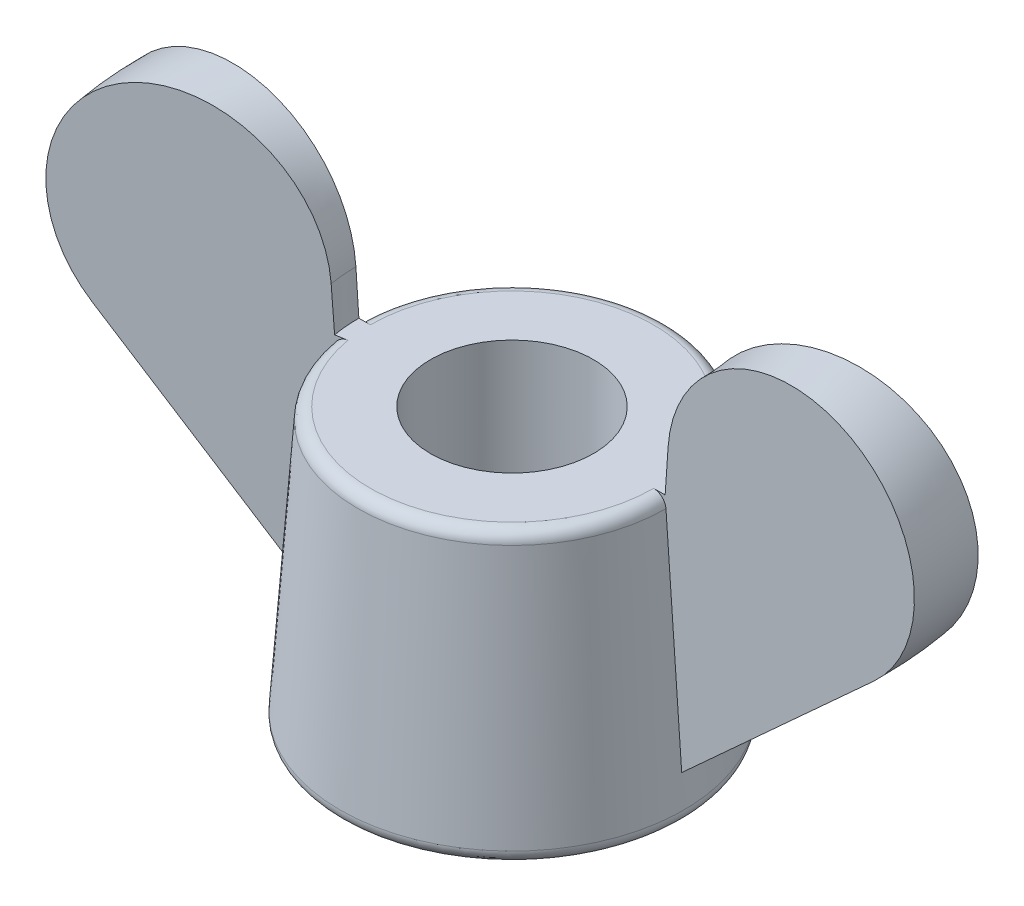
ISO-10303-21;
HEADER;
FILE_DESCRIPTION(('STEP AP214'),'2;1');
FILE_NAME('part.step','',(''),(''),'','','');
FILE_SCHEMA(('AUTOMOTIVE_DESIGN { 1 0 10303 214 1 1 1 1 }'));
ENDSEC;
DATA;
#1=APPLICATION_CONTEXT('core data for automotive mechanical design processes');
#2=APPLICATION_PROTOCOL_DEFINITION('international standard','automotive_design',2000,#1);
#3=PRODUCT_CONTEXT('',#1,'mechanical');
#4=PRODUCT('Part','Part','',(#3));
#5=PRODUCT_RELATED_PRODUCT_CATEGORY('part','',(#4));
#6=PRODUCT_DEFINITION_FORMATION('','',#4);
#7=PRODUCT_DEFINITION_CONTEXT('part definition',#1,'design');
#8=PRODUCT_DEFINITION('design','',#6,#7);
#9=PRODUCT_DEFINITION_SHAPE('','',#8);
#10=(LENGTH_UNIT() NAMED_UNIT(*) SI_UNIT(.MILLI.,.METRE.));
#11=(NAMED_UNIT(*) PLANE_ANGLE_UNIT() SI_UNIT($,.RADIAN.));
#12=(NAMED_UNIT(*) SI_UNIT($,.STERADIAN.) SOLID_ANGLE_UNIT());
#13=UNCERTAINTY_MEASURE_WITH_UNIT(LENGTH_MEASURE(1.E-05),#10,'distance_accuracy_value','');
#14=(GEOMETRIC_REPRESENTATION_CONTEXT(3) GLOBAL_UNCERTAINTY_ASSIGNED_CONTEXT((#13)) GLOBAL_UNIT_ASSIGNED_CONTEXT((#10,
#11,#12)) REPRESENTATION_CONTEXT('',''));
#15=CARTESIAN_POINT('',(0.,0.,0.));
#16=DIRECTION('',(0.,0.,1.));
#17=DIRECTION('',(1.,0.,0.));
#18=AXIS2_PLACEMENT_3D('',#15,#16,#17);
#19=CARTESIAN_POINT('',(0.,5.6,0.));
#20=DIRECTION('',(0.,-1.,0.));
#21=DIRECTION('',(0.,0.,-1.));
#22=AXIS2_PLACEMENT_3D('',#19,#20,#21);
#23=CONICAL_SURFACE('',#22,3.1,0.0713074647852909);
#24=CARTESIAN_POINT('',(0.,0.267811762496978,0.));
#25=DIRECTION('',(0.,-1.,0.));
#26=DIRECTION('',(0.,0.,-1.));
#27=AXIS2_PLACEMENT_3D('',#24,#25,#26);
#28=CIRCLE('',#27,3.48087058839308);
#29=CARTESIAN_POINT('',(0.,0.267811762496978,-3.48087058839308));
#30=VERTEX_POINT('',#29);
#31=EDGE_CURVE('E212',#30,#30,#28,.F.);
#32=ORIENTED_EDGE('',*,*,#31,.T.);
#33=EDGE_LOOP('',(#32));
#34=FACE_BOUND('',#33,.T.);
#35=DIRECTION('',(0.0712470499879102,0.997458699830735,0.));
#36=VECTOR('',#35,1.);
#37=CARTESIAN_POINT('',(0.,48.9999999999996,0.));
#38=LINE('',#37,#36);
#39=CARTESIAN_POINT('',(-3.43558406990929,0.901823021269996,0.));
#40=VERTEX_POINT('',#39);
#41=CARTESIAN_POINT('',(-3.11658487410736,5.36781176249697,0.));
#42=VERTEX_POINT('',#41);
#43=EDGE_CURVE('E152',#40,#42,#38,.T.);
#44=ORIENTED_EDGE('',*,*,#43,.T.);
#45=CARTESIAN_POINT('',(0.,5.36781176249698,0.));
#46=DIRECTION('',(0.,1.,0.));
#47=DIRECTION('',(0.,0.,1.));
#48=AXIS2_PLACEMENT_3D('',#45,#46,#47);
#49=CIRCLE('',#48,3.11658487410736);
#50=CARTESIAN_POINT('',(3.0692369469415,5.36781176249697,-0.541189283933064));
#51=VERTEX_POINT('',#50);
#52=EDGE_CURVE('E218',#42,#51,#49,.F.);
#53=ORIENTED_EDGE('',*,*,#52,.T.);
#54=DIRECTION('',(-0.0701646472073423,0.997458699830735,0.0123719203945453));
#55=VECTOR('',#54,1.);
#56=CARTESIAN_POINT('',(0.,48.9999999999996,0.));
#57=LINE('',#56,#55);
#58=CARTESIAN_POINT('',(3.3833898281719,0.901823021269996,-0.596582912961285));
#59=VERTEX_POINT('',#58);
#60=EDGE_CURVE('E201',#59,#51,#57,.T.);
#61=ORIENTED_EDGE('',*,*,#60,.F.);
#62=CARTESIAN_POINT('',(0.,0.901823021269996,0.));
#63=DIRECTION('',(0.,1.,0.));
#64=DIRECTION('',(0.,0.,1.));
#65=AXIS2_PLACEMENT_3D('',#62,#63,#64);
#66=CIRCLE('',#65,3.43558406990929);
#67=CARTESIAN_POINT('',(3.43558406990929,0.901823021269995,0.));
#68=VERTEX_POINT('',#67);
#69=EDGE_CURVE('E210',#59,#68,#66,.F.);
#70=ORIENTED_EDGE('',*,*,#69,.T.);
#71=DIRECTION('',(-0.0712470499879102,0.997458699830735,0.));
#72=VECTOR('',#71,1.);
#73=CARTESIAN_POINT('',(0.,48.9999999999996,0.));
#74=LINE('',#73,#72);
#75=CARTESIAN_POINT('',(3.11658487410736,5.36781176249697,0.));
#76=VERTEX_POINT('',#75);
#77=EDGE_CURVE('E207',#68,#76,#74,.T.);
#78=ORIENTED_EDGE('',*,*,#77,.T.);
#79=CARTESIAN_POINT('',(0.,5.36781176249697,0.));
#80=DIRECTION('',(0.,1.,0.));
#81=DIRECTION('',(0.,0.,1.));
#82=AXIS2_PLACEMENT_3D('',#79,#80,#81);
#83=CIRCLE('',#82,3.11658487410736);
#84=CARTESIAN_POINT('',(-3.0692369469415,5.36781176249697,0.541189283933066));
#85=VERTEX_POINT('',#84);
#86=EDGE_CURVE('E215',#76,#85,#83,.F.);
#87=ORIENTED_EDGE('',*,*,#86,.T.);
#88=DIRECTION('',(0.0701646472073423,0.997458699830735,-0.0123719203945454));
#89=VECTOR('',#88,1.);
#90=CARTESIAN_POINT('',(0.,48.9999999999996,0.));
#91=LINE('',#90,#89);
#92=CARTESIAN_POINT('',(-3.3833898281719,0.901823021269995,0.596582912961287));
#93=VERTEX_POINT('',#92);
#94=EDGE_CURVE('E178',#93,#85,#91,.T.);
#95=ORIENTED_EDGE('',*,*,#94,.F.);
#96=CARTESIAN_POINT('',(0.,0.901823021269996,0.));
#97=DIRECTION('',(0.,-1.,0.));
#98=DIRECTION('',(0.173648177666931,0.,0.984807753012208));
#99=AXIS2_PLACEMENT_3D('',#96,#97,#98);
#100=CIRCLE('',#99,3.43558406990929);
#101=EDGE_CURVE('E157',#40,#93,#100,.F.);
#102=ORIENTED_EDGE('',*,*,#101,.F.);
#103=EDGE_LOOP('',(#44,#53,#61,#70,#78,#87,#95,#102));
#104=FACE_BOUND('',#103,.T.);
#105=ADVANCED_FACE('F46',(#34,#104),#23,.T.);
#106=CARTESIAN_POINT('',(0.,5.6,0.));
#107=DIRECTION('',(0.,-1.,0.));
#108=DIRECTION('',(0.,0.,-1.));
#109=AXIS2_PLACEMENT_3D('',#106,#107,#108);
#110=PLANE('',#109);
#111=CARTESIAN_POINT('',(0.,5.6,0.));
#112=DIRECTION('',(0.,1.,0.));
#113=DIRECTION('',(0.,0.,1.));
#114=AXIS2_PLACEMENT_3D('',#111,#112,#113);
#115=CIRCLE('',#114,1.64999999999999);
#116=CARTESIAN_POINT('',(0.,5.6,1.64999999999999));
#117=VERTEX_POINT('',#116);
#118=EDGE_CURVE('E162',#117,#117,#115,.T.);
#119=ORIENTED_EDGE('',*,*,#118,.F.);
#120=EDGE_LOOP('',(#119));
#121=FACE_BOUND('',#120,.T.);
#122=CARTESIAN_POINT('',(0.,5.6,0.));
#123=DIRECTION('',(0.,-1.,0.));
#124=DIRECTION('',(0.,0.,-1.));
#125=AXIS2_PLACEMENT_3D('',#122,#123,#124);
#126=CIRCLE('',#125,3.1);
#127=CARTESIAN_POINT('',(3.05290403433784,5.6,-0.538309350767485));
#128=VERTEX_POINT('',#127);
#129=CARTESIAN_POINT('',(3.1,5.6,0.));
#130=VERTEX_POINT('',#129);
#131=EDGE_CURVE('E204',#128,#130,#126,.T.);
#132=ORIENTED_EDGE('',*,*,#131,.F.);
#133=DIRECTION('',(-0.984807753012208,0.,0.173648177666931));
#134=VECTOR('',#133,1.);
#135=CARTESIAN_POINT('',(0.,5.6,0.));
#136=LINE('',#135,#134);
#137=CARTESIAN_POINT('',(2.82366068171581,5.6,-0.497887562552155));
#138=VERTEX_POINT('',#137);
#139=EDGE_CURVE('E69',#128,#138,#136,.T.);
#140=ORIENTED_EDGE('',*,*,#139,.T.);
#141=CARTESIAN_POINT('',(0.,5.6,0.));
#142=DIRECTION('',(0.,-1.,0.));
#143=DIRECTION('',(0.,0.,-1.));
#144=AXIS2_PLACEMENT_3D('',#141,#142,#143);
#145=CIRCLE('',#144,2.86722019914968);
#146=CARTESIAN_POINT('',(-2.86722019914968,5.6,0.));
#147=VERTEX_POINT('',#146);
#148=EDGE_CURVE('E229',#138,#147,#145,.F.);
#149=ORIENTED_EDGE('',*,*,#148,.T.);
#150=DIRECTION('',(-1.,0.,0.));
#151=VECTOR('',#150,1.);
#152=CARTESIAN_POINT('',(0.,5.6,0.));
#153=LINE('',#152,#151);
#154=CARTESIAN_POINT('',(-3.1,5.6,0.));
#155=VERTEX_POINT('',#154);
#156=EDGE_CURVE('E227',#147,#155,#153,.T.);
#157=ORIENTED_EDGE('',*,*,#156,.T.);
#158=CARTESIAN_POINT('',(0.,5.6,0.));
#159=DIRECTION('',(0.,1.,0.));
#160=DIRECTION('',(-0.173648177666931,0.,-0.984807753012208));
#161=AXIS2_PLACEMENT_3D('',#158,#159,#160);
#162=CIRCLE('',#161,3.1);
#163=CARTESIAN_POINT('',(-3.05290403433784,5.6,0.538309350767487));
#164=VERTEX_POINT('',#163);
#165=EDGE_CURVE('E176',#155,#164,#162,.T.);
#166=ORIENTED_EDGE('',*,*,#165,.T.);
#167=DIRECTION('',(0.984807753012208,0.,-0.173648177666931));
#168=VECTOR('',#167,1.);
#169=CARTESIAN_POINT('',(0.,5.6,0.));
#170=LINE('',#169,#168);
#171=CARTESIAN_POINT('',(-2.82366068171581,5.6,0.497887562552157));
#172=VERTEX_POINT('',#171);
#173=EDGE_CURVE('E61',#164,#172,#170,.T.);
#174=ORIENTED_EDGE('',*,*,#173,.T.);
#175=CARTESIAN_POINT('',(0.,5.6,0.));
#176=DIRECTION('',(0.,-1.,0.));
#177=DIRECTION('',(0.,0.,-1.));
#178=AXIS2_PLACEMENT_3D('',#175,#176,#177);
#179=CIRCLE('',#178,2.86722019914968);
#180=CARTESIAN_POINT('',(2.86722019914968,5.6,0.));
#181=VERTEX_POINT('',#180);
#182=EDGE_CURVE('E223',#172,#181,#179,.F.);
#183=ORIENTED_EDGE('',*,*,#182,.T.);
#184=DIRECTION('',(1.,0.,0.));
#185=VECTOR('',#184,1.);
#186=CARTESIAN_POINT('',(0.,5.6,0.));
#187=LINE('',#186,#185);
#188=EDGE_CURVE('E221',#181,#130,#187,.T.);
#189=ORIENTED_EDGE('',*,*,#188,.T.);
#190=EDGE_LOOP('',(#132,#140,#149,#157,#166,#174,#183,#189));
#191=FACE_BOUND('',#190,.T.);
#192=ADVANCED_FACE('F243',(#121,#191),#110,.F.);
#193=CARTESIAN_POINT('',(0.,0.,0.));
#194=DIRECTION('',(0.,-1.,0.));
#195=DIRECTION('',(0.,0.,-1.));
#196=AXIS2_PLACEMENT_3D('',#193,#194,#195);
#197=PLANE('',#196);
#198=CARTESIAN_POINT('',(0.,0.,0.));
#199=DIRECTION('',(0.,-1.,0.));
#200=DIRECTION('',(0.,0.,-1.));
#201=AXIS2_PLACEMENT_3D('',#198,#199,#200);
#202=CIRCLE('',#201,3.23150591343539);
#203=CARTESIAN_POINT('',(0.,0.,-3.23150591343539));
#204=VERTEX_POINT('',#203);
#205=EDGE_CURVE('E233',#204,#204,#202,.T.);
#206=ORIENTED_EDGE('',*,*,#205,.T.);
#207=EDGE_LOOP('',(#206));
#208=FACE_BOUND('',#207,.T.);
#209=CARTESIAN_POINT('',(0.,0.,0.));
#210=DIRECTION('',(0.,-1.,0.));
#211=DIRECTION('',(0.,0.,-1.));
#212=AXIS2_PLACEMENT_3D('',#209,#210,#211);
#213=CIRCLE('',#212,1.64999999999999);
#214=CARTESIAN_POINT('',(0.,0.,-1.64999999999999));
#215=VERTEX_POINT('',#214);
#216=EDGE_CURVE('E159',#215,#215,#213,.T.);
#217=ORIENTED_EDGE('',*,*,#216,.F.);
#218=EDGE_LOOP('',(#217));
#219=FACE_BOUND('',#218,.T.);
#220=ADVANCED_FACE('F294',(#208,#219),#197,.T.);
#221=CARTESIAN_POINT('',(0.,0.895958370948181,0.));
#222=DIRECTION('',(0.,1.,0.));
#223=DIRECTION('',(0.,0.,1.));
#224=AXIS2_PLACEMENT_3D('',#221,#222,#223);
#225=CONICAL_SURFACE('',#224,3.4291540018868,0.831354449540094);
#226=ORIENTED_EDGE('',*,*,#69,.F.);
#227=DIRECTION('',(0.727620066743565,0.673875650529626,-0.128299049471785));
#228=VECTOR('',#227,1.);
#229=CARTESIAN_POINT('',(1.09423894070426,-1.21824363708453,-0.192943848588012));
#230=LINE('',#229,#228);
#231=CARTESIAN_POINT('',(7.2207195736683,4.45571494472408,-1.27320768096745));
#232=VERTEX_POINT('',#231);
#233=EDGE_CURVE('E189',#59,#232,#230,.T.);
#234=ORIENTED_EDGE('',*,*,#233,.T.);
#235=CARTESIAN_POINT('',(0.,4.45571494472408,0.));
#236=DIRECTION('',(0.,-1.,0.));
#237=DIRECTION('',(0.,0.,-1.));
#238=AXIS2_PLACEMENT_3D('',#235,#236,#237);
#239=CIRCLE('',#238,7.33211081206709);
#240=CARTESIAN_POINT('',(7.33211081206709,4.45571494472408,0.));
#241=VERTEX_POINT('',#240);
#242=EDGE_CURVE('E198',#232,#241,#239,.T.);
#243=ORIENTED_EDGE('',*,*,#242,.T.);
#244=DIRECTION('',(0.738844779113498,0.673875650529626,0.));
#245=VECTOR('',#244,1.);
#246=CARTESIAN_POINT('',(1.11111934015278,-1.21824363708453,0.));
#247=LINE('',#246,#245);
#248=EDGE_CURVE('E181',#68,#241,#247,.T.);
#249=ORIENTED_EDGE('',*,*,#248,.F.);
#250=EDGE_LOOP('',(#226,#234,#243,#249));
#251=FACE_BOUND('',#250,.T.);
#252=ADVANCED_FACE('F256',(#251),#225,.T.);
#253=CARTESIAN_POINT('',(0.,0.,0.));
#254=DIRECTION('',(0.,0.,1.));
#255=DIRECTION('',(1.,0.,0.));
#256=AXIS2_PLACEMENT_3D('',#253,#254,#255);
#257=PLANE('',#256);
#258=ORIENTED_EDGE('',*,*,#77,.F.);
#259=ORIENTED_EDGE('',*,*,#248,.T.);
#260=CARTESIAN_POINT('',(5.65,6.3,0.));
#261=DIRECTION('',(0.,0.,1.));
#262=DIRECTION('',(1.,0.,0.));
#263=AXIS2_PLACEMENT_3D('',#260,#261,#262);
#264=CIRCLE('',#263,2.49617390203229);
#265=CARTESIAN_POINT('',(3.15966709648286,6.47066393540229,0.));
#266=VERTEX_POINT('',#265);
#267=EDGE_CURVE('E183',#241,#266,#264,.T.);
#268=ORIENTED_EDGE('',*,*,#267,.T.);
#269=DIRECTION('',(0.0683702106104647,0.997660019395927,0.));
#270=VECTOR('',#269,1.);
#271=CARTESIAN_POINT('',(2.70353183072841,-0.185274579581645,0.));
#272=LINE('',#271,#270);
#273=EDGE_CURVE('E186',#130,#266,#272,.T.);
#274=ORIENTED_EDGE('',*,*,#273,.F.);
#275=ORIENTED_EDGE('',*,*,#188,.F.);
#276=CARTESIAN_POINT('',(2.86722019914968,5.35,0.));
#277=DIRECTION('',(0.,0.,1.));
#278=DIRECTION('',(1.,0.,0.));
#279=AXIS2_PLACEMENT_3D('',#276,#277,#278);
#280=CIRCLE('',#279,0.25);
#281=EDGE_CURVE('E13',#181,#76,#280,.F.);
#282=ORIENTED_EDGE('',*,*,#281,.T.);
#283=EDGE_LOOP('',(#258,#259,#268,#274,#275,#282));
#284=FACE_BOUND('',#283,.T.);
#285=ADVANCED_FACE('F249',(#284),#257,.T.);
#286=CARTESIAN_POINT('',(0.,0.,0.));
#287=DIRECTION('',(0.173648177666931,0.,0.984807753012208));
#288=DIRECTION('',(0.984807753012208,0.,-0.173648177666931));
#289=AXIS2_PLACEMENT_3D('',#286,#287,#288);
#290=PLANE('',#289);
#291=ORIENTED_EDGE('',*,*,#233,.F.);
#292=ORIENTED_EDGE('',*,*,#60,.T.);
#293=CARTESIAN_POINT('',(2.82366068171581,5.35,-0.497887562552155));
#294=DIRECTION('',(0.173648177666931,0.,0.984807753012208));
#295=DIRECTION('',(0.984807753012208,0.,-0.173648177666931));
#296=AXIS2_PLACEMENT_3D('',#293,#294,#295);
#297=CIRCLE('',#296,0.25);
#298=EDGE_CURVE('E236',#51,#138,#297,.T.);
#299=ORIENTED_EDGE('',*,*,#298,.T.);
#300=ORIENTED_EDGE('',*,*,#139,.F.);
#301=DIRECTION('',(0.0673315134842631,0.997660019395927,-0.0118723624792114));
#302=VECTOR('',#301,1.);
#303=CARTESIAN_POINT('',(2.66245910741662,-0.185274579581645,-0.469463375670529));
#304=LINE('',#303,#302);
#305=CARTESIAN_POINT('',(3.11166465355389,6.47066393540229,-0.548670433338411));
#306=VERTEX_POINT('',#305);
#307=EDGE_CURVE('E194',#128,#306,#304,.T.);
#308=ORIENTED_EDGE('',*,*,#307,.T.);
#309=CARTESIAN_POINT('',(5.56416380451898,6.3,-0.981112203818159));
#310=DIRECTION('',(0.173648177666931,0.,0.984807753012208));
#311=DIRECTION('',(0.984807753012208,0.,-0.173648177666931));
#312=AXIS2_PLACEMENT_3D('',#309,#310,#311);
#313=CIRCLE('',#312,2.49617390203229);
#314=EDGE_CURVE('E191',#232,#306,#313,.T.);
#315=ORIENTED_EDGE('',*,*,#314,.F.);
#316=EDGE_LOOP('',(#291,#292,#299,#300,#308,#315));
#317=FACE_BOUND('',#316,.T.);
#318=ADVANCED_FACE('F259',(#317),#290,.F.);
#319=CARTESIAN_POINT('',(0.,6.3,0.));
#320=DIRECTION('',(0.,-1.,0.));
#321=DIRECTION('',(0.,0.,-1.));
#322=AXIS2_PLACEMENT_3D('',#319,#320,#321);
#323=TOROIDAL_SURFACE('',#322,5.65,2.49617390203229);
#324=CARTESIAN_POINT('',(0.,6.47066393540229,0.));
#325=DIRECTION('',(0.,-1.,0.));
#326=DIRECTION('',(0.,0.,-1.));
#327=AXIS2_PLACEMENT_3D('',#324,#325,#326);
#328=CIRCLE('',#327,3.15966709648286);
#329=EDGE_CURVE('E196',#306,#266,#328,.T.);
#330=ORIENTED_EDGE('',*,*,#329,.T.);
#331=ORIENTED_EDGE('',*,*,#267,.F.);
#332=ORIENTED_EDGE('',*,*,#242,.F.);
#333=ORIENTED_EDGE('',*,*,#314,.T.);
#334=EDGE_LOOP('',(#330,#331,#332,#333));
#335=FACE_BOUND('',#334,.T.);
#336=ADVANCED_FACE('F262',(#335),#323,.T.);
#337=CARTESIAN_POINT('',(0.,5.6,0.));
#338=DIRECTION('',(0.,1.,0.));
#339=DIRECTION('',(0.,0.,1.));
#340=AXIS2_PLACEMENT_3D('',#337,#338,#339);
#341=CONICAL_SURFACE('',#340,3.1,0.0684235888977124);
#342=ORIENTED_EDGE('',*,*,#131,.T.);
#343=ORIENTED_EDGE('',*,*,#273,.T.);
#344=ORIENTED_EDGE('',*,*,#329,.F.);
#345=ORIENTED_EDGE('',*,*,#307,.F.);
#346=EDGE_LOOP('',(#342,#343,#344,#345));
#347=FACE_BOUND('',#346,.T.);
#348=ADVANCED_FACE('F265',(#347),#341,.F.);
#349=CARTESIAN_POINT('',(0.,0.895958370948181,0.));
#350=DIRECTION('',(0.,1.,0.));
#351=DIRECTION('',(0.173648177666931,0.,0.984807753012208));
#352=AXIS2_PLACEMENT_3D('',#349,#350,#351);
#353=CONICAL_SURFACE('',#352,3.4291540018868,0.831354449540094);
#354=ORIENTED_EDGE('',*,*,#101,.T.);
#355=DIRECTION('',(-0.727620066743565,0.673875650529626,0.128299049471785));
#356=VECTOR('',#355,1.);
#357=CARTESIAN_POINT('',(-1.09423894070426,-1.21824363708453,0.192943848588013));
#358=LINE('',#357,#356);
#359=CARTESIAN_POINT('',(-7.2207195736683,4.45571494472408,1.27320768096745));
#360=VERTEX_POINT('',#359);
#361=EDGE_CURVE('E139',#93,#360,#358,.T.);
#362=ORIENTED_EDGE('',*,*,#361,.T.);
#363=CARTESIAN_POINT('',(0.,4.45571494472408,0.));
#364=DIRECTION('',(0.,1.,0.));
#365=DIRECTION('',(-0.173648177666931,0.,-0.984807753012208));
#366=AXIS2_PLACEMENT_3D('',#363,#364,#365);
#367=CIRCLE('',#366,7.33211081206709);
#368=CARTESIAN_POINT('',(-7.33211081206709,4.45571494472408,0.));
#369=VERTEX_POINT('',#368);
#370=EDGE_CURVE('E146',#369,#360,#367,.T.);
#371=ORIENTED_EDGE('',*,*,#370,.F.);
#372=DIRECTION('',(-0.738844779113498,0.673875650529626,0.));
#373=VECTOR('',#372,1.);
#374=CARTESIAN_POINT('',(-1.11111934015278,-1.21824363708453,0.));
#375=LINE('',#374,#373);
#376=EDGE_CURVE('E167',#40,#369,#375,.T.);
#377=ORIENTED_EDGE('',*,*,#376,.F.);
#378=EDGE_LOOP('',(#354,#362,#371,#377));
#379=FACE_BOUND('',#378,.T.);
#380=ADVANCED_FACE('F155',(#379),#353,.T.);
#381=CARTESIAN_POINT('',(0.,0.,0.));
#382=DIRECTION('',(0.173648177666931,0.,0.984807753012208));
#383=DIRECTION('',(-0.984807753012208,0.,0.173648177666931));
#384=AXIS2_PLACEMENT_3D('',#381,#382,#383);
#385=PLANE('',#384);
#386=ORIENTED_EDGE('',*,*,#94,.T.);
#387=CARTESIAN_POINT('',(-2.82366068171581,5.35,0.497887562552157));
#388=DIRECTION('',(0.173648177666931,0.,0.984807753012208));
#389=DIRECTION('',(0.984807753012208,0.,-0.173648177666931));
#390=AXIS2_PLACEMENT_3D('',#387,#388,#389);
#391=CIRCLE('',#390,0.25);
#392=EDGE_CURVE('E54',#85,#172,#391,.F.);
#393=ORIENTED_EDGE('',*,*,#392,.T.);
#394=ORIENTED_EDGE('',*,*,#173,.F.);
#395=DIRECTION('',(-0.0673315134842631,0.997660019395927,0.0118723624792115));
#396=VECTOR('',#395,1.);
#397=CARTESIAN_POINT('',(-2.66245910741662,-0.185274579581645,0.469463375670531));
#398=LINE('',#397,#396);
#399=CARTESIAN_POINT('',(-3.11166465355389,6.47066393540229,0.548670433338413));
#400=VERTEX_POINT('',#399);
#401=EDGE_CURVE('E142',#164,#400,#398,.T.);
#402=ORIENTED_EDGE('',*,*,#401,.T.);
#403=CARTESIAN_POINT('',(-5.56416380451898,6.3,0.981112203818162));
#404=DIRECTION('',(-0.173648177666931,0.,-0.984807753012208));
#405=DIRECTION('',(-0.984807753012208,0.,0.173648177666931));
#406=AXIS2_PLACEMENT_3D('',#403,#404,#405);
#407=CIRCLE('',#406,2.49617390203229);
#408=EDGE_CURVE('E134',#360,#400,#407,.T.);
#409=ORIENTED_EDGE('',*,*,#408,.F.);
#410=ORIENTED_EDGE('',*,*,#361,.F.);
#411=EDGE_LOOP('',(#386,#393,#394,#402,#409,#410));
#412=FACE_BOUND('',#411,.T.);
#413=ADVANCED_FACE('F137',(#412),#385,.T.);
#414=CARTESIAN_POINT('',(0.,0.,0.));
#415=DIRECTION('',(0.,0.,1.));
#416=DIRECTION('',(-1.,0.,0.));
#417=AXIS2_PLACEMENT_3D('',#414,#415,#416);
#418=PLANE('',#417);
#419=ORIENTED_EDGE('',*,*,#376,.T.);
#420=CARTESIAN_POINT('',(-5.65,6.3,0.));
#421=DIRECTION('',(0.,0.,-1.));
#422=DIRECTION('',(-1.,0.,0.));
#423=AXIS2_PLACEMENT_3D('',#420,#421,#422);
#424=CIRCLE('',#423,2.49617390203229);
#425=CARTESIAN_POINT('',(-3.15966709648286,6.47066393540229,0.));
#426=VERTEX_POINT('',#425);
#427=EDGE_CURVE('E149',#369,#426,#424,.T.);
#428=ORIENTED_EDGE('',*,*,#427,.T.);
#429=DIRECTION('',(-0.0683702106104647,0.997660019395927,0.));
#430=VECTOR('',#429,1.);
#431=CARTESIAN_POINT('',(-2.70353183072841,-0.185274579581645,0.));
#432=LINE('',#431,#430);
#433=EDGE_CURVE('E170',#155,#426,#432,.T.);
#434=ORIENTED_EDGE('',*,*,#433,.F.);
#435=ORIENTED_EDGE('',*,*,#156,.F.);
#436=CARTESIAN_POINT('',(-2.86722019914968,5.35,0.));
#437=DIRECTION('',(0.,0.,1.));
#438=DIRECTION('',(1.,0.,0.));
#439=AXIS2_PLACEMENT_3D('',#436,#437,#438);
#440=CIRCLE('',#439,0.25);
#441=EDGE_CURVE('E238',#147,#42,#440,.T.);
#442=ORIENTED_EDGE('',*,*,#441,.T.);
#443=ORIENTED_EDGE('',*,*,#43,.F.);
#444=EDGE_LOOP('',(#419,#428,#434,#435,#442,#443));
#445=FACE_BOUND('',#444,.T.);
#446=ADVANCED_FACE('F273',(#445),#418,.F.);
#447=CARTESIAN_POINT('',(0.,6.3,0.));
#448=DIRECTION('',(0.,-1.,0.));
#449=DIRECTION('',(-0.173648177666931,0.,-0.984807753012208));
#450=AXIS2_PLACEMENT_3D('',#447,#448,#449);
#451=TOROIDAL_SURFACE('',#450,5.65,2.49617390203229);
#452=CARTESIAN_POINT('',(0.,6.47066393540229,0.));
#453=DIRECTION('',(0.,1.,0.));
#454=DIRECTION('',(-0.173648177666931,0.,-0.984807753012208));
#455=AXIS2_PLACEMENT_3D('',#452,#453,#454);
#456=CIRCLE('',#455,3.15966709648286);
#457=EDGE_CURVE('E153',#426,#400,#456,.T.);
#458=ORIENTED_EDGE('',*,*,#457,.F.);
#459=ORIENTED_EDGE('',*,*,#427,.F.);
#460=ORIENTED_EDGE('',*,*,#370,.T.);
#461=ORIENTED_EDGE('',*,*,#408,.T.);
#462=EDGE_LOOP('',(#458,#459,#460,#461));
#463=FACE_BOUND('',#462,.T.);
#464=ADVANCED_FACE('F147',(#463),#451,.T.);
#465=CARTESIAN_POINT('',(0.,5.6,0.));
#466=DIRECTION('',(0.,1.,0.));
#467=DIRECTION('',(0.173648177666931,0.,0.984807753012208));
#468=AXIS2_PLACEMENT_3D('',#465,#466,#467);
#469=CONICAL_SURFACE('',#468,3.1,0.0684235888977124);
#470=ORIENTED_EDGE('',*,*,#165,.F.);
#471=ORIENTED_EDGE('',*,*,#433,.T.);
#472=ORIENTED_EDGE('',*,*,#457,.T.);
#473=ORIENTED_EDGE('',*,*,#401,.F.);
#474=EDGE_LOOP('',(#470,#471,#472,#473));
#475=FACE_BOUND('',#474,.T.);
#476=ADVANCED_FACE('F276',(#475),#469,.F.);
#477=CARTESIAN_POINT('',(0.,5.6,0.));
#478=DIRECTION('',(0.,1.,0.));
#479=DIRECTION('',(0.,0.,1.));
#480=AXIS2_PLACEMENT_3D('',#477,#478,#479);
#481=CYLINDRICAL_SURFACE('',#480,1.64999999999999);
#482=ORIENTED_EDGE('',*,*,#216,.T.);
#483=EDGE_LOOP('',(#482));
#484=FACE_BOUND('',#483,.T.);
#485=ORIENTED_EDGE('',*,*,#118,.T.);
#486=EDGE_LOOP('',(#485));
#487=FACE_BOUND('',#486,.T.);
#488=ADVANCED_FACE('F278',(#484,#487),#481,.F.);
#489=CARTESIAN_POINT('',(0.,5.35,0.));
#490=DIRECTION('',(0.,-1.,0.));
#491=DIRECTION('',(0.,0.,-1.));
#492=AXIS2_PLACEMENT_3D('',#489,#490,#491);
#493=TOROIDAL_SURFACE('',#492,2.86722019914968,0.25);
#494=ORIENTED_EDGE('',*,*,#441,.F.);
#495=ORIENTED_EDGE('',*,*,#148,.F.);
#496=ORIENTED_EDGE('',*,*,#298,.F.);
#497=ORIENTED_EDGE('',*,*,#52,.F.);
#498=EDGE_LOOP('',(#494,#495,#496,#497));
#499=FACE_BOUND('',#498,.T.);
#500=ADVANCED_FACE('F269',(#499),#493,.T.);
#501=CARTESIAN_POINT('',(0.,5.35,0.));
#502=DIRECTION('',(0.,-1.,0.));
#503=DIRECTION('',(0.,0.,-1.));
#504=AXIS2_PLACEMENT_3D('',#501,#502,#503);
#505=TOROIDAL_SURFACE('',#504,2.86722019914968,0.25);
#506=ORIENTED_EDGE('',*,*,#281,.F.);
#507=ORIENTED_EDGE('',*,*,#182,.F.);
#508=ORIENTED_EDGE('',*,*,#392,.F.);
#509=ORIENTED_EDGE('',*,*,#86,.F.);
#510=EDGE_LOOP('',(#506,#507,#508,#509));
#511=FACE_BOUND('',#510,.T.);
#512=ADVANCED_FACE('F246',(#511),#505,.T.);
#513=CARTESIAN_POINT('',(0.,0.25,0.));
#514=DIRECTION('',(0.,-1.,0.));
#515=DIRECTION('',(0.,0.,-1.));
#516=AXIS2_PLACEMENT_3D('',#513,#514,#515);
#517=TOROIDAL_SURFACE('',#516,3.23150591343539,0.25);
#518=ORIENTED_EDGE('',*,*,#31,.F.);
#519=EDGE_LOOP('',(#518));
#520=FACE_BOUND('',#519,.T.);
#521=ORIENTED_EDGE('',*,*,#205,.F.);
#522=EDGE_LOOP('',(#521));
#523=FACE_BOUND('',#522,.T.);
#524=ADVANCED_FACE('F48',(#520,#523),#517,.T.);
#525=CLOSED_SHELL('',(#105,#192,#220,#252,#285,#318,#336,#348,#380,#413,#446,#464,#476,#488,
#500,#512,#524));
#526=MANIFOLD_SOLID_BREP('B2',#525);
#527=ADVANCED_BREP_SHAPE_REPRESENTATION('',(#18,#526),#14);
#528=SHAPE_DEFINITION_REPRESENTATION(#9,#527);
ENDSEC;
END-ISO-10303-21;
